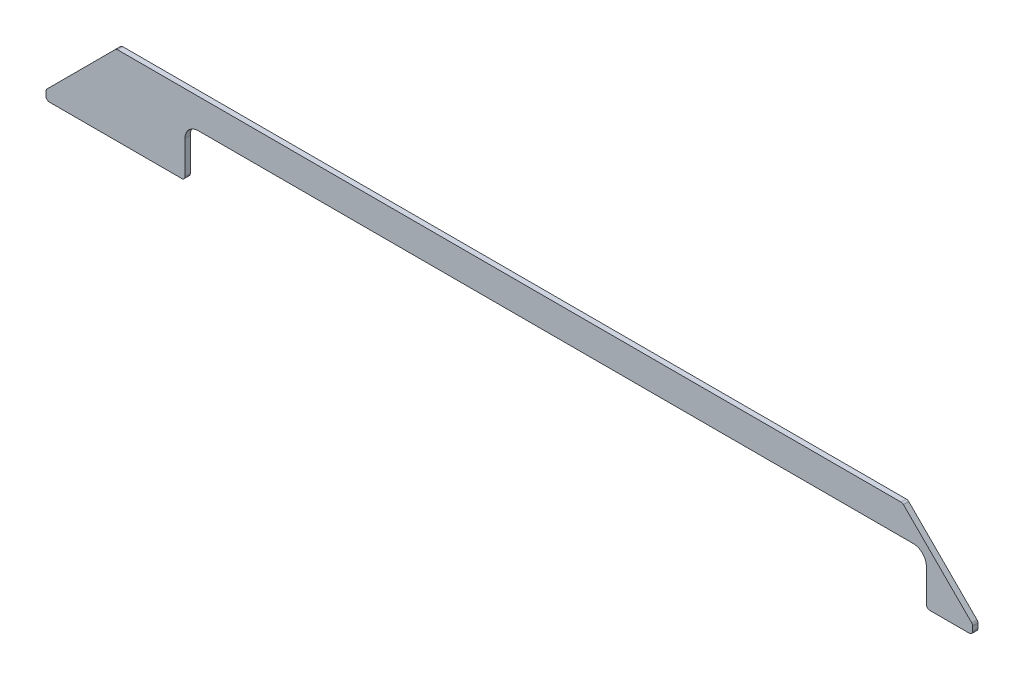
ISO-10303-21;
HEADER;
FILE_DESCRIPTION(('STEP AP214'),'2;1');
FILE_NAME('part.step','',(''),(''),'','','');
FILE_SCHEMA(('AUTOMOTIVE_DESIGN { 1 0 10303 214 1 1 1 1 }'));
ENDSEC;
DATA;
#1=APPLICATION_CONTEXT('core data for automotive mechanical design processes');
#2=APPLICATION_PROTOCOL_DEFINITION('international standard','automotive_design',2000,#1);
#3=PRODUCT_CONTEXT('',#1,'mechanical');
#4=PRODUCT('Part','Part','',(#3));
#5=PRODUCT_RELATED_PRODUCT_CATEGORY('part','',(#4));
#6=PRODUCT_DEFINITION_FORMATION('','',#4);
#7=PRODUCT_DEFINITION_CONTEXT('part definition',#1,'design');
#8=PRODUCT_DEFINITION('design','',#6,#7);
#9=PRODUCT_DEFINITION_SHAPE('','',#8);
#10=(LENGTH_UNIT() NAMED_UNIT(*) SI_UNIT(.MILLI.,.METRE.));
#11=(NAMED_UNIT(*) PLANE_ANGLE_UNIT() SI_UNIT($,.RADIAN.));
#12=(NAMED_UNIT(*) SI_UNIT($,.STERADIAN.) SOLID_ANGLE_UNIT());
#13=UNCERTAINTY_MEASURE_WITH_UNIT(LENGTH_MEASURE(1.E-05),#10,'distance_accuracy_value','');
#14=(GEOMETRIC_REPRESENTATION_CONTEXT(3) GLOBAL_UNCERTAINTY_ASSIGNED_CONTEXT((#13)) GLOBAL_UNIT_ASSIGNED_CONTEXT((#10,
#11,#12)) REPRESENTATION_CONTEXT('',''));
#15=CARTESIAN_POINT('',(0.,0.,0.));
#16=DIRECTION('',(0.,0.,1.));
#17=DIRECTION('',(1.,0.,0.));
#18=AXIS2_PLACEMENT_3D('',#15,#16,#17);
#19=CARTESIAN_POINT('',(42.,0.,1.6));
#20=DIRECTION('',(-1.,0.,0.));
#21=DIRECTION('',(0.,0.,1.));
#22=AXIS2_PLACEMENT_3D('',#19,#20,#21);
#23=PLANE('',#22);
#24=DIRECTION('',(0.,1.,0.));
#25=VECTOR('',#24,1.);
#26=CARTESIAN_POINT('',(42.,0.,1.6));
#27=LINE('',#26,#25);
#28=CARTESIAN_POINT('',(42.,1.,1.6));
#29=VERTEX_POINT('',#28);
#30=CARTESIAN_POINT('',(42.,11.,1.6));
#31=VERTEX_POINT('',#30);
#32=EDGE_CURVE('E175',#29,#31,#27,.T.);
#33=ORIENTED_EDGE('',*,*,#32,.F.);
#34=DIRECTION('',(0.,0.,-1.));
#35=VECTOR('',#34,1.);
#36=CARTESIAN_POINT('',(42.,1.,1.6));
#37=LINE('',#36,#35);
#38=CARTESIAN_POINT('',(42.,1.,0.));
#39=VERTEX_POINT('',#38);
#40=EDGE_CURVE('E258',#29,#39,#37,.T.);
#41=ORIENTED_EDGE('',*,*,#40,.T.);
#42=DIRECTION('',(0.,1.,0.));
#43=VECTOR('',#42,1.);
#44=CARTESIAN_POINT('',(42.,0.,0.));
#45=LINE('',#44,#43);
#46=CARTESIAN_POINT('',(42.,11.,0.));
#47=VERTEX_POINT('',#46);
#48=EDGE_CURVE('E199',#39,#47,#45,.T.);
#49=ORIENTED_EDGE('',*,*,#48,.T.);
#50=DIRECTION('',(0.,0.,-1.));
#51=VECTOR('',#50,1.);
#52=CARTESIAN_POINT('',(42.,11.,1.6));
#53=LINE('',#52,#51);
#54=EDGE_CURVE('E192',#31,#47,#53,.T.);
#55=ORIENTED_EDGE('',*,*,#54,.F.);
#56=EDGE_LOOP('',(#33,#41,#49,#55));
#57=FACE_BOUND('',#56,.T.);
#58=ADVANCED_FACE('F39',(#57),#23,.F.);
#59=CARTESIAN_POINT('',(46.,11.,1.6));
#60=DIRECTION('',(0.,0.,-1.));
#61=DIRECTION('',(-1.,0.,0.));
#62=AXIS2_PLACEMENT_3D('',#59,#60,#61);
#63=CYLINDRICAL_SURFACE('',#62,4.);
#64=CARTESIAN_POINT('',(46.,11.,0.));
#65=DIRECTION('',(0.,0.,1.));
#66=DIRECTION('',(1.,0.,0.));
#67=AXIS2_PLACEMENT_3D('',#64,#65,#66);
#68=CIRCLE('',#67,4.);
#69=CARTESIAN_POINT('',(46.,15.,0.));
#70=VERTEX_POINT('',#69);
#71=EDGE_CURVE('E316',#47,#70,#68,.F.);
#72=ORIENTED_EDGE('',*,*,#71,.T.);
#73=DIRECTION('',(0.,0.,-1.));
#74=VECTOR('',#73,1.);
#75=CARTESIAN_POINT('',(46.,15.,1.6));
#76=LINE('',#75,#74);
#77=CARTESIAN_POINT('',(46.,15.,1.6));
#78=VERTEX_POINT('',#77);
#79=EDGE_CURVE('E194',#78,#70,#76,.T.);
#80=ORIENTED_EDGE('',*,*,#79,.F.);
#81=CARTESIAN_POINT('',(46.,11.,1.6));
#82=DIRECTION('',(0.,0.,1.));
#83=DIRECTION('',(1.,0.,0.));
#84=AXIS2_PLACEMENT_3D('',#81,#82,#83);
#85=CIRCLE('',#84,4.);
#86=EDGE_CURVE('E179',#31,#78,#85,.F.);
#87=ORIENTED_EDGE('',*,*,#86,.F.);
#88=ORIENTED_EDGE('',*,*,#54,.T.);
#89=EDGE_LOOP('',(#72,#80,#87,#88));
#90=FACE_BOUND('',#89,.T.);
#91=ADVANCED_FACE('F191',(#90),#63,.F.);
#92=CARTESIAN_POINT('',(0.,15.,1.6));
#93=DIRECTION('',(0.,1.,0.));
#94=DIRECTION('',(0.,0.,1.));
#95=AXIS2_PLACEMENT_3D('',#92,#93,#94);
#96=PLANE('',#95);
#97=DIRECTION('',(1.,0.,0.));
#98=VECTOR('',#97,1.);
#99=CARTESIAN_POINT('',(0.,15.,0.));
#100=LINE('',#99,#98);
#101=CARTESIAN_POINT('',(262.,15.,0.));
#102=VERTEX_POINT('',#101);
#103=EDGE_CURVE('E310',#70,#102,#100,.T.);
#104=ORIENTED_EDGE('',*,*,#103,.T.);
#105=DIRECTION('',(0.,0.,-1.));
#106=VECTOR('',#105,1.);
#107=CARTESIAN_POINT('',(262.,15.,1.6));
#108=LINE('',#107,#106);
#109=CARTESIAN_POINT('',(262.,15.,1.6));
#110=VERTEX_POINT('',#109);
#111=EDGE_CURVE('E205',#110,#102,#108,.T.);
#112=ORIENTED_EDGE('',*,*,#111,.F.);
#113=DIRECTION('',(1.,0.,0.));
#114=VECTOR('',#113,1.);
#115=CARTESIAN_POINT('',(0.,15.,1.6));
#116=LINE('',#115,#114);
#117=EDGE_CURVE('E196',#78,#110,#116,.T.);
#118=ORIENTED_EDGE('',*,*,#117,.F.);
#119=ORIENTED_EDGE('',*,*,#79,.T.);
#120=EDGE_LOOP('',(#104,#112,#118,#119));
#121=FACE_BOUND('',#120,.T.);
#122=ADVANCED_FACE('F351',(#121),#96,.F.);
#123=CARTESIAN_POINT('',(262.,11.,1.6));
#124=DIRECTION('',(0.,0.,-1.));
#125=DIRECTION('',(-1.,0.,0.));
#126=AXIS2_PLACEMENT_3D('',#123,#124,#125);
#127=CYLINDRICAL_SURFACE('',#126,4.00000000000003);
#128=CARTESIAN_POINT('',(262.,11.,0.));
#129=DIRECTION('',(0.,0.,1.));
#130=DIRECTION('',(1.,0.,0.));
#131=AXIS2_PLACEMENT_3D('',#128,#129,#130);
#132=CIRCLE('',#131,4.00000000000003);
#133=CARTESIAN_POINT('',(266.,11.,0.));
#134=VERTEX_POINT('',#133);
#135=EDGE_CURVE('E305',#102,#134,#132,.F.);
#136=ORIENTED_EDGE('',*,*,#135,.T.);
#137=DIRECTION('',(0.,0.,-1.));
#138=VECTOR('',#137,1.);
#139=CARTESIAN_POINT('',(266.,11.,1.6));
#140=LINE('',#139,#138);
#141=CARTESIAN_POINT('',(266.,11.,1.6));
#142=VERTEX_POINT('',#141);
#143=EDGE_CURVE('E294',#142,#134,#140,.T.);
#144=ORIENTED_EDGE('',*,*,#143,.F.);
#145=CARTESIAN_POINT('',(262.,11.,1.6));
#146=DIRECTION('',(0.,0.,1.));
#147=DIRECTION('',(1.,0.,0.));
#148=AXIS2_PLACEMENT_3D('',#145,#146,#147);
#149=CIRCLE('',#148,4.00000000000003);
#150=EDGE_CURVE('E307',#110,#142,#149,.F.);
#151=ORIENTED_EDGE('',*,*,#150,.F.);
#152=ORIENTED_EDGE('',*,*,#111,.T.);
#153=EDGE_LOOP('',(#136,#144,#151,#152));
#154=FACE_BOUND('',#153,.T.);
#155=ADVANCED_FACE('F303',(#154),#127,.F.);
#156=CARTESIAN_POINT('',(266.,-1.34236056613769E-12,1.6));
#157=DIRECTION('',(-1.,0.,0.));
#158=DIRECTION('',(0.,-1.,0.));
#159=AXIS2_PLACEMENT_3D('',#156,#157,#158);
#160=PLANE('',#159);
#161=DIRECTION('',(0.,1.,0.));
#162=VECTOR('',#161,1.);
#163=CARTESIAN_POINT('',(266.,-1.34236056613769E-12,0.));
#164=LINE('',#163,#162);
#165=CARTESIAN_POINT('',(266.,1.00000000000001,0.));
#166=VERTEX_POINT('',#165);
#167=EDGE_CURVE('E312',#166,#134,#164,.T.);
#168=ORIENTED_EDGE('',*,*,#167,.F.);
#169=DIRECTION('',(0.,0.,-1.));
#170=VECTOR('',#169,1.);
#171=CARTESIAN_POINT('',(266.,1.00000000000001,1.6));
#172=LINE('',#171,#170);
#173=CARTESIAN_POINT('',(266.,1.00000000000001,1.6));
#174=VERTEX_POINT('',#173);
#175=EDGE_CURVE('E256',#166,#174,#172,.F.);
#176=ORIENTED_EDGE('',*,*,#175,.T.);
#177=DIRECTION('',(0.,1.,0.));
#178=VECTOR('',#177,1.);
#179=CARTESIAN_POINT('',(266.,-1.34236056613769E-12,1.6));
#180=LINE('',#179,#178);
#181=EDGE_CURVE('E353',#174,#142,#180,.T.);
#182=ORIENTED_EDGE('',*,*,#181,.T.);
#183=ORIENTED_EDGE('',*,*,#143,.T.);
#184=EDGE_LOOP('',(#168,#176,#182,#183));
#185=FACE_BOUND('',#184,.T.);
#186=ADVANCED_FACE('F424',(#185),#160,.T.);
#187=CARTESIAN_POINT('',(0.,0.,1.6));
#188=DIRECTION('',(0.,1.,0.));
#189=DIRECTION('',(0.,0.,1.));
#190=AXIS2_PLACEMENT_3D('',#187,#188,#189);
#191=PLANE('',#190);
#192=DIRECTION('',(1.,0.,0.));
#193=VECTOR('',#192,1.);
#194=CARTESIAN_POINT('',(0.,0.,0.));
#195=LINE('',#194,#193);
#196=CARTESIAN_POINT('',(267.,0.,0.));
#197=VERTEX_POINT('',#196);
#198=CARTESIAN_POINT('',(279.,0.,0.));
#199=VERTEX_POINT('',#198);
#200=EDGE_CURVE('E314',#197,#199,#195,.T.);
#201=ORIENTED_EDGE('',*,*,#200,.T.);
#202=DIRECTION('',(0.,0.,-1.));
#203=VECTOR('',#202,1.);
#204=CARTESIAN_POINT('',(279.,0.,1.6));
#205=LINE('',#204,#203);
#206=CARTESIAN_POINT('',(279.,0.,1.6));
#207=VERTEX_POINT('',#206);
#208=EDGE_CURVE('E254',#199,#207,#205,.F.);
#209=ORIENTED_EDGE('',*,*,#208,.T.);
#210=DIRECTION('',(1.,0.,0.));
#211=VECTOR('',#210,1.);
#212=CARTESIAN_POINT('',(0.,0.,1.6));
#213=LINE('',#212,#211);
#214=CARTESIAN_POINT('',(267.,0.,1.6));
#215=VERTEX_POINT('',#214);
#216=EDGE_CURVE('E357',#215,#207,#213,.T.);
#217=ORIENTED_EDGE('',*,*,#216,.F.);
#218=DIRECTION('',(0.,0.,-1.));
#219=VECTOR('',#218,1.);
#220=CARTESIAN_POINT('',(267.,0.,0.));
#221=LINE('',#220,#219);
#222=EDGE_CURVE('E251',#215,#197,#221,.T.);
#223=ORIENTED_EDGE('',*,*,#222,.T.);
#224=EDGE_LOOP('',(#201,#209,#217,#223));
#225=FACE_BOUND('',#224,.T.);
#226=ADVANCED_FACE('F412',(#225),#191,.F.);
#227=CARTESIAN_POINT('',(280.,0.,1.6));
#228=DIRECTION('',(-1.,0.,0.));
#229=DIRECTION('',(0.,0.,1.));
#230=AXIS2_PLACEMENT_3D('',#227,#228,#229);
#231=PLANE('',#230);
#232=DIRECTION('',(0.,1.,0.));
#233=VECTOR('',#232,1.);
#234=CARTESIAN_POINT('',(280.,0.,1.6));
#235=LINE('',#234,#233);
#236=CARTESIAN_POINT('',(280.,1.,1.6));
#237=VERTEX_POINT('',#236);
#238=CARTESIAN_POINT('',(280.,2.37258300203055,1.6));
#239=VERTEX_POINT('',#238);
#240=EDGE_CURVE('E345',#237,#239,#235,.T.);
#241=ORIENTED_EDGE('',*,*,#240,.F.);
#242=DIRECTION('',(0.,0.,-1.));
#243=VECTOR('',#242,1.);
#244=CARTESIAN_POINT('',(280.,1.,1.6));
#245=LINE('',#244,#243);
#246=CARTESIAN_POINT('',(280.,1.,0.));
#247=VERTEX_POINT('',#246);
#248=EDGE_CURVE('E248',#237,#247,#245,.T.);
#249=ORIENTED_EDGE('',*,*,#248,.T.);
#250=DIRECTION('',(0.,1.,0.));
#251=VECTOR('',#250,1.);
#252=CARTESIAN_POINT('',(280.,0.,0.));
#253=LINE('',#252,#251);
#254=CARTESIAN_POINT('',(280.,2.37258300203055,0.));
#255=VERTEX_POINT('',#254);
#256=EDGE_CURVE('E322',#247,#255,#253,.T.);
#257=ORIENTED_EDGE('',*,*,#256,.T.);
#258=DIRECTION('',(0.,0.,-1.));
#259=VECTOR('',#258,1.);
#260=CARTESIAN_POINT('',(280.,2.37258300203055,1.6));
#261=LINE('',#260,#259);
#262=EDGE_CURVE('E246',#255,#239,#261,.F.);
#263=ORIENTED_EDGE('',*,*,#262,.T.);
#264=EDGE_LOOP('',(#241,#249,#257,#263));
#265=FACE_BOUND('',#264,.T.);
#266=ADVANCED_FACE('F374',(#265),#231,.F.);
#267=CARTESIAN_POINT('',(141.393398282201,141.393398282202,1.6));
#268=DIRECTION('',(-0.707106781186545,-0.70710678118655,0.));
#269=DIRECTION('',(0.70710678118655,-0.707106781186545,0.));
#270=AXIS2_PLACEMENT_3D('',#267,#268,#269);
#271=PLANE('',#270);
#272=DIRECTION('',(-0.70710678118655,0.707106781186545,0.));
#273=VECTOR('',#272,1.);
#274=CARTESIAN_POINT('',(141.393398282201,141.393398282202,0.));
#275=LINE('',#274,#273);
#276=CARTESIAN_POINT('',(279.707106781187,3.0796897832171,0.));
#277=VERTEX_POINT('',#276);
#278=CARTESIAN_POINT('',(259.079689783217,23.7071067811865,0.));
#279=VERTEX_POINT('',#278);
#280=EDGE_CURVE('E290',#277,#279,#275,.T.);
#281=ORIENTED_EDGE('',*,*,#280,.T.);
#282=DIRECTION('',(0.,0.,-1.));
#283=VECTOR('',#282,1.);
#284=CARTESIAN_POINT('',(259.079689783217,23.7071067811866,1.6));
#285=LINE('',#284,#283);
#286=CARTESIAN_POINT('',(259.079689783217,23.7071067811865,1.6));
#287=VERTEX_POINT('',#286);
#288=EDGE_CURVE('E230',#279,#287,#285,.F.);
#289=ORIENTED_EDGE('',*,*,#288,.T.);
#290=DIRECTION('',(-0.70710678118655,0.707106781186545,0.));
#291=VECTOR('',#290,1.);
#292=CARTESIAN_POINT('',(141.393398282201,141.393398282202,1.6));
#293=LINE('',#292,#291);
#294=CARTESIAN_POINT('',(279.707106781187,3.0796897832171,1.6));
#295=VERTEX_POINT('',#294);
#296=EDGE_CURVE('E338',#295,#287,#293,.T.);
#297=ORIENTED_EDGE('',*,*,#296,.F.);
#298=DIRECTION('',(0.,0.,-1.));
#299=VECTOR('',#298,1.);
#300=CARTESIAN_POINT('',(279.707106781187,3.07968978321713,1.6));
#301=LINE('',#300,#299);
#302=EDGE_CURVE('E227',#295,#277,#301,.T.);
#303=ORIENTED_EDGE('',*,*,#302,.T.);
#304=EDGE_LOOP('',(#281,#289,#297,#303));
#305=FACE_BOUND('',#304,.T.);
#306=ADVANCED_FACE('F328',(#305),#271,.F.);
#307=CARTESIAN_POINT('',(0.,24.,1.6));
#308=DIRECTION('',(0.,1.,0.));
#309=DIRECTION('',(0.,0.,1.));
#310=AXIS2_PLACEMENT_3D('',#307,#308,#309);
#311=PLANE('',#310);
#312=DIRECTION('',(1.,0.,0.));
#313=VECTOR('',#312,1.);
#314=CARTESIAN_POINT('',(0.,24.,1.6));
#315=LINE('',#314,#313);
#316=CARTESIAN_POINT('',(21.6274169979696,24.,1.6));
#317=VERTEX_POINT('',#316);
#318=CARTESIAN_POINT('',(258.37258300203,24.,1.6));
#319=VERTEX_POINT('',#318);
#320=EDGE_CURVE('E337',#317,#319,#315,.T.);
#321=ORIENTED_EDGE('',*,*,#320,.T.);
#322=DIRECTION('',(0.,0.,-1.));
#323=VECTOR('',#322,1.);
#324=CARTESIAN_POINT('',(258.37258300203,24.,0.));
#325=LINE('',#324,#323);
#326=CARTESIAN_POINT('',(258.37258300203,24.,0.));
#327=VERTEX_POINT('',#326);
#328=EDGE_CURVE('E203',#319,#327,#325,.T.);
#329=ORIENTED_EDGE('',*,*,#328,.T.);
#330=DIRECTION('',(1.,0.,0.));
#331=VECTOR('',#330,1.);
#332=CARTESIAN_POINT('',(0.,24.,0.));
#333=LINE('',#332,#331);
#334=CARTESIAN_POINT('',(21.6274169979696,24.,0.));
#335=VERTEX_POINT('',#334);
#336=EDGE_CURVE('E287',#335,#327,#333,.T.);
#337=ORIENTED_EDGE('',*,*,#336,.F.);
#338=DIRECTION('',(0.,0.,-1.));
#339=VECTOR('',#338,1.);
#340=CARTESIAN_POINT('',(21.6274169979696,24.,1.6));
#341=LINE('',#340,#339);
#342=EDGE_CURVE('E201',#335,#317,#341,.F.);
#343=ORIENTED_EDGE('',*,*,#342,.T.);
#344=EDGE_LOOP('',(#321,#329,#337,#343));
#345=FACE_BOUND('',#344,.T.);
#346=ADVANCED_FACE('F340',(#345),#311,.T.);
#347=CARTESIAN_POINT('',(-1.39339828220181,1.39339828220181,1.6));
#348=DIRECTION('',(-0.707106781186546,0.707106781186549,0.));
#349=DIRECTION('',(-0.707106781186549,-0.707106781186546,0.));
#350=AXIS2_PLACEMENT_3D('',#347,#348,#349);
#351=PLANE('',#350);
#352=DIRECTION('',(0.707106781186549,0.707106781186546,0.));
#353=VECTOR('',#352,1.);
#354=CARTESIAN_POINT('',(-1.39339828220181,1.39339828220181,0.));
#355=LINE('',#354,#353);
#356=CARTESIAN_POINT('',(0.292893218813454,3.07968978321706,0.));
#357=VERTEX_POINT('',#356);
#358=CARTESIAN_POINT('',(20.920310216783,23.7071067811866,0.));
#359=VERTEX_POINT('',#358);
#360=EDGE_CURVE('E275',#357,#359,#355,.T.);
#361=ORIENTED_EDGE('',*,*,#360,.F.);
#362=DIRECTION('',(0.,0.,-1.));
#363=VECTOR('',#362,1.);
#364=CARTESIAN_POINT('',(0.292893218813454,3.07968978321706,1.6));
#365=LINE('',#364,#363);
#366=CARTESIAN_POINT('',(0.292893218813454,3.07968978321706,1.6));
#367=VERTEX_POINT('',#366);
#368=EDGE_CURVE('E11',#357,#367,#365,.F.);
#369=ORIENTED_EDGE('',*,*,#368,.T.);
#370=DIRECTION('',(0.707106781186549,0.707106781186546,0.));
#371=VECTOR('',#370,1.);
#372=CARTESIAN_POINT('',(-1.39339828220181,1.39339828220181,1.6));
#373=LINE('',#372,#371);
#374=CARTESIAN_POINT('',(20.920310216783,23.7071067811866,1.6));
#375=VERTEX_POINT('',#374);
#376=EDGE_CURVE('E278',#367,#375,#373,.T.);
#377=ORIENTED_EDGE('',*,*,#376,.T.);
#378=DIRECTION('',(0.,0.,-1.));
#379=VECTOR('',#378,1.);
#380=CARTESIAN_POINT('',(20.920310216783,23.7071067811865,1.6));
#381=LINE('',#380,#379);
#382=EDGE_CURVE('E47',#375,#359,#381,.T.);
#383=ORIENTED_EDGE('',*,*,#382,.T.);
#384=EDGE_LOOP('',(#361,#369,#377,#383));
#385=FACE_BOUND('',#384,.T.);
#386=ADVANCED_FACE('F274',(#385),#351,.T.);
#387=CARTESIAN_POINT('',(0.,0.,1.6));
#388=DIRECTION('',(-1.,0.,0.));
#389=DIRECTION('',(0.,0.,1.));
#390=AXIS2_PLACEMENT_3D('',#387,#388,#389);
#391=PLANE('',#390);
#392=DIRECTION('',(0.,1.,0.));
#393=VECTOR('',#392,1.);
#394=CARTESIAN_POINT('',(0.,0.,1.6));
#395=LINE('',#394,#393);
#396=CARTESIAN_POINT('',(0.,1.,1.6));
#397=VERTEX_POINT('',#396);
#398=CARTESIAN_POINT('',(0.,2.37258300203052,1.6));
#399=VERTEX_POINT('',#398);
#400=EDGE_CURVE('E343',#397,#399,#395,.T.);
#401=ORIENTED_EDGE('',*,*,#400,.T.);
#402=DIRECTION('',(0.,0.,-1.));
#403=VECTOR('',#402,1.);
#404=CARTESIAN_POINT('',(0.,2.37258300203052,1.6));
#405=LINE('',#404,#403);
#406=CARTESIAN_POINT('',(0.,2.37258300203052,0.));
#407=VERTEX_POINT('',#406);
#408=EDGE_CURVE('E266',#399,#407,#405,.T.);
#409=ORIENTED_EDGE('',*,*,#408,.T.);
#410=DIRECTION('',(0.,1.,0.));
#411=VECTOR('',#410,1.);
#412=CARTESIAN_POINT('',(0.,0.,0.));
#413=LINE('',#412,#411);
#414=CARTESIAN_POINT('',(0.,1.,0.));
#415=VERTEX_POINT('',#414);
#416=EDGE_CURVE('E286',#415,#407,#413,.T.);
#417=ORIENTED_EDGE('',*,*,#416,.F.);
#418=DIRECTION('',(0.,0.,-1.));
#419=VECTOR('',#418,1.);
#420=CARTESIAN_POINT('',(0.,1.,1.6));
#421=LINE('',#420,#419);
#422=EDGE_CURVE('E264',#415,#397,#421,.F.);
#423=ORIENTED_EDGE('',*,*,#422,.T.);
#424=EDGE_LOOP('',(#401,#409,#417,#423));
#425=FACE_BOUND('',#424,.T.);
#426=ADVANCED_FACE('F411',(#425),#391,.T.);
#427=CARTESIAN_POINT('',(1.,0.,0.));
#428=VERTEX_POINT('',#427);
#429=CARTESIAN_POINT('',(41.,0.,0.));
#430=VERTEX_POINT('',#429);
#431=EDGE_CURVE('E187',#428,#430,#195,.T.);
#432=ORIENTED_EDGE('',*,*,#431,.T.);
#433=DIRECTION('',(0.,0.,-1.));
#434=VECTOR('',#433,1.);
#435=CARTESIAN_POINT('',(41.,0.,1.6));
#436=LINE('',#435,#434);
#437=CARTESIAN_POINT('',(41.,0.,1.6));
#438=VERTEX_POINT('',#437);
#439=EDGE_CURVE('E54',#430,#438,#436,.F.);
#440=ORIENTED_EDGE('',*,*,#439,.T.);
#441=CARTESIAN_POINT('',(1.,0.,1.6));
#442=VERTEX_POINT('',#441);
#443=EDGE_CURVE('E296',#442,#438,#213,.T.);
#444=ORIENTED_EDGE('',*,*,#443,.F.);
#445=DIRECTION('',(0.,0.,-1.));
#446=VECTOR('',#445,1.);
#447=CARTESIAN_POINT('',(1.,0.,0.));
#448=LINE('',#447,#446);
#449=EDGE_CURVE('E260',#442,#428,#448,.T.);
#450=ORIENTED_EDGE('',*,*,#449,.T.);
#451=EDGE_LOOP('',(#432,#440,#444,#450));
#452=FACE_BOUND('',#451,.T.);
#453=ADVANCED_FACE('F406',(#452),#191,.F.);
#454=CARTESIAN_POINT('',(0.,0.,1.6));
#455=DIRECTION('',(0.,0.,1.));
#456=DIRECTION('',(1.,0.,0.));
#457=AXIS2_PLACEMENT_3D('',#454,#455,#456);
#458=PLANE('',#457);
#459=ORIENTED_EDGE('',*,*,#296,.T.);
#460=CARTESIAN_POINT('',(258.37258300203,23.,1.6));
#461=DIRECTION('',(0.,0.,1.));
#462=DIRECTION('',(1.,0.,0.));
#463=AXIS2_PLACEMENT_3D('',#460,#461,#462);
#464=CIRCLE('',#463,1.);
#465=EDGE_CURVE('E244',#287,#319,#464,.T.);
#466=ORIENTED_EDGE('',*,*,#465,.T.);
#467=ORIENTED_EDGE('',*,*,#320,.F.);
#468=CARTESIAN_POINT('',(21.6274169979696,23.,1.6));
#469=DIRECTION('',(0.,0.,1.));
#470=DIRECTION('',(1.,0.,0.));
#471=AXIS2_PLACEMENT_3D('',#468,#469,#470);
#472=CIRCLE('',#471,1.);
#473=EDGE_CURVE('E232',#317,#375,#472,.T.);
#474=ORIENTED_EDGE('',*,*,#473,.T.);
#475=ORIENTED_EDGE('',*,*,#376,.F.);
#476=CARTESIAN_POINT('',(1.,2.37258300203052,1.6));
#477=DIRECTION('',(0.,0.,1.));
#478=DIRECTION('',(1.,0.,0.));
#479=AXIS2_PLACEMENT_3D('',#476,#477,#478);
#480=CIRCLE('',#479,1.);
#481=EDGE_CURVE('E235',#367,#399,#480,.T.);
#482=ORIENTED_EDGE('',*,*,#481,.T.);
#483=ORIENTED_EDGE('',*,*,#400,.F.);
#484=CARTESIAN_POINT('',(1.,1.,1.6));
#485=DIRECTION('',(0.,0.,1.));
#486=DIRECTION('',(1.,0.,0.));
#487=AXIS2_PLACEMENT_3D('',#484,#485,#486);
#488=CIRCLE('',#487,1.);
#489=EDGE_CURVE('E61',#397,#442,#488,.T.);
#490=ORIENTED_EDGE('',*,*,#489,.T.);
#491=ORIENTED_EDGE('',*,*,#443,.T.);
#492=CARTESIAN_POINT('',(41.,1.,1.6));
#493=DIRECTION('',(0.,0.,1.));
#494=DIRECTION('',(1.,0.,0.));
#495=AXIS2_PLACEMENT_3D('',#492,#493,#494);
#496=CIRCLE('',#495,1.);
#497=EDGE_CURVE('E182',#438,#29,#496,.T.);
#498=ORIENTED_EDGE('',*,*,#497,.T.);
#499=ORIENTED_EDGE('',*,*,#32,.T.);
#500=ORIENTED_EDGE('',*,*,#86,.T.);
#501=ORIENTED_EDGE('',*,*,#117,.T.);
#502=ORIENTED_EDGE('',*,*,#150,.T.);
#503=ORIENTED_EDGE('',*,*,#181,.F.);
#504=CARTESIAN_POINT('',(267.,1.,1.6));
#505=DIRECTION('',(0.,0.,1.));
#506=DIRECTION('',(1.,0.,0.));
#507=AXIS2_PLACEMENT_3D('',#504,#505,#506);
#508=CIRCLE('',#507,1.);
#509=EDGE_CURVE('E238',#174,#215,#508,.T.);
#510=ORIENTED_EDGE('',*,*,#509,.T.);
#511=ORIENTED_EDGE('',*,*,#216,.T.);
#512=CARTESIAN_POINT('',(279.,1.,1.6));
#513=DIRECTION('',(0.,0.,1.));
#514=DIRECTION('',(1.,0.,0.));
#515=AXIS2_PLACEMENT_3D('',#512,#513,#514);
#516=CIRCLE('',#515,1.);
#517=EDGE_CURVE('E242',#207,#237,#516,.T.);
#518=ORIENTED_EDGE('',*,*,#517,.T.);
#519=ORIENTED_EDGE('',*,*,#240,.T.);
#520=CARTESIAN_POINT('',(279.,2.37258300203055,1.6));
#521=DIRECTION('',(0.,0.,1.));
#522=DIRECTION('',(1.,0.,0.));
#523=AXIS2_PLACEMENT_3D('',#520,#521,#522);
#524=CIRCLE('',#523,1.);
#525=EDGE_CURVE('E240',#239,#295,#524,.T.);
#526=ORIENTED_EDGE('',*,*,#525,.T.);
#527=EDGE_LOOP('',(#459,#466,#467,#474,#475,#482,#483,#490,#491,#498,#499,#500,#501,#502,#503,
#510,#511,#518,#519,#526));
#528=FACE_BOUND('',#527,.T.);
#529=ADVANCED_FACE('F178',(#528),#458,.T.);
#530=CARTESIAN_POINT('',(0.,0.,0.));
#531=DIRECTION('',(0.,0.,1.));
#532=DIRECTION('',(1.,0.,0.));
#533=AXIS2_PLACEMENT_3D('',#530,#531,#532);
#534=PLANE('',#533);
#535=ORIENTED_EDGE('',*,*,#336,.T.);
#536=CARTESIAN_POINT('',(258.37258300203,23.,0.));
#537=DIRECTION('',(0.,0.,1.));
#538=DIRECTION('',(1.,0.,0.));
#539=AXIS2_PLACEMENT_3D('',#536,#537,#538);
#540=CIRCLE('',#539,1.);
#541=EDGE_CURVE('E225',#327,#279,#540,.F.);
#542=ORIENTED_EDGE('',*,*,#541,.T.);
#543=ORIENTED_EDGE('',*,*,#280,.F.);
#544=CARTESIAN_POINT('',(279.,2.37258300203055,0.));
#545=DIRECTION('',(0.,0.,1.));
#546=DIRECTION('',(1.,0.,0.));
#547=AXIS2_PLACEMENT_3D('',#544,#545,#546);
#548=CIRCLE('',#547,1.);
#549=EDGE_CURVE('E221',#277,#255,#548,.F.);
#550=ORIENTED_EDGE('',*,*,#549,.T.);
#551=ORIENTED_EDGE('',*,*,#256,.F.);
#552=CARTESIAN_POINT('',(279.,1.,0.));
#553=DIRECTION('',(0.,0.,1.));
#554=DIRECTION('',(1.,0.,0.));
#555=AXIS2_PLACEMENT_3D('',#552,#553,#554);
#556=CIRCLE('',#555,1.);
#557=EDGE_CURVE('E223',#247,#199,#556,.F.);
#558=ORIENTED_EDGE('',*,*,#557,.T.);
#559=ORIENTED_EDGE('',*,*,#200,.F.);
#560=CARTESIAN_POINT('',(267.,1.,0.));
#561=DIRECTION('',(0.,0.,1.));
#562=DIRECTION('',(1.,0.,0.));
#563=AXIS2_PLACEMENT_3D('',#560,#561,#562);
#564=CIRCLE('',#563,1.);
#565=EDGE_CURVE('E219',#197,#166,#564,.F.);
#566=ORIENTED_EDGE('',*,*,#565,.T.);
#567=ORIENTED_EDGE('',*,*,#167,.T.);
#568=ORIENTED_EDGE('',*,*,#135,.F.);
#569=ORIENTED_EDGE('',*,*,#103,.F.);
#570=ORIENTED_EDGE('',*,*,#71,.F.);
#571=ORIENTED_EDGE('',*,*,#48,.F.);
#572=CARTESIAN_POINT('',(41.,1.,0.));
#573=DIRECTION('',(0.,0.,1.));
#574=DIRECTION('',(1.,0.,0.));
#575=AXIS2_PLACEMENT_3D('',#572,#573,#574);
#576=CIRCLE('',#575,1.);
#577=EDGE_CURVE('E217',#39,#430,#576,.F.);
#578=ORIENTED_EDGE('',*,*,#577,.T.);
#579=ORIENTED_EDGE('',*,*,#431,.F.);
#580=CARTESIAN_POINT('',(1.,1.,0.));
#581=DIRECTION('',(0.,0.,1.));
#582=DIRECTION('',(1.,0.,0.));
#583=AXIS2_PLACEMENT_3D('',#580,#581,#582);
#584=CIRCLE('',#583,1.);
#585=EDGE_CURVE('E213',#428,#415,#584,.F.);
#586=ORIENTED_EDGE('',*,*,#585,.T.);
#587=ORIENTED_EDGE('',*,*,#416,.T.);
#588=CARTESIAN_POINT('',(1.,2.37258300203052,0.));
#589=DIRECTION('',(0.,0.,1.));
#590=DIRECTION('',(1.,0.,0.));
#591=AXIS2_PLACEMENT_3D('',#588,#589,#590);
#592=CIRCLE('',#591,1.);
#593=EDGE_CURVE('E215',#407,#357,#592,.F.);
#594=ORIENTED_EDGE('',*,*,#593,.T.);
#595=ORIENTED_EDGE('',*,*,#360,.T.);
#596=CARTESIAN_POINT('',(21.6274169979696,23.,0.));
#597=DIRECTION('',(0.,0.,1.));
#598=DIRECTION('',(1.,0.,0.));
#599=AXIS2_PLACEMENT_3D('',#596,#597,#598);
#600=CIRCLE('',#599,1.);
#601=EDGE_CURVE('E211',#359,#335,#600,.F.);
#602=ORIENTED_EDGE('',*,*,#601,.T.);
#603=EDGE_LOOP('',(#535,#542,#543,#550,#551,#558,#559,#566,#567,#568,#569,#570,#571,#578,#579,
#586,#587,#594,#595,#602));
#604=FACE_BOUND('',#603,.T.);
#605=ADVANCED_FACE('F283',(#604),#534,.F.);
#606=CARTESIAN_POINT('',(258.37258300203,23.,1.6));
#607=DIRECTION('',(0.,0.,1.));
#608=DIRECTION('',(1.,0.,0.));
#609=AXIS2_PLACEMENT_3D('',#606,#607,#608);
#610=CYLINDRICAL_SURFACE('',#609,1.);
#611=ORIENTED_EDGE('',*,*,#465,.F.);
#612=ORIENTED_EDGE('',*,*,#288,.F.);
#613=ORIENTED_EDGE('',*,*,#541,.F.);
#614=ORIENTED_EDGE('',*,*,#328,.F.);
#615=EDGE_LOOP('',(#611,#612,#613,#614));
#616=FACE_BOUND('',#615,.T.);
#617=ADVANCED_FACE('F333',(#616),#610,.T.);
#618=CARTESIAN_POINT('',(279.,1.,1.6));
#619=DIRECTION('',(0.,0.,-1.));
#620=DIRECTION('',(-1.,0.,0.));
#621=AXIS2_PLACEMENT_3D('',#618,#619,#620);
#622=CYLINDRICAL_SURFACE('',#621,1.);
#623=ORIENTED_EDGE('',*,*,#517,.F.);
#624=ORIENTED_EDGE('',*,*,#208,.F.);
#625=ORIENTED_EDGE('',*,*,#557,.F.);
#626=ORIENTED_EDGE('',*,*,#248,.F.);
#627=EDGE_LOOP('',(#623,#624,#625,#626));
#628=FACE_BOUND('',#627,.T.);
#629=ADVANCED_FACE('F371',(#628),#622,.T.);
#630=CARTESIAN_POINT('',(279.,2.37258300203055,1.6));
#631=DIRECTION('',(0.,0.,-1.));
#632=DIRECTION('',(-1.,0.,0.));
#633=AXIS2_PLACEMENT_3D('',#630,#631,#632);
#634=CYLINDRICAL_SURFACE('',#633,1.);
#635=ORIENTED_EDGE('',*,*,#525,.F.);
#636=ORIENTED_EDGE('',*,*,#262,.F.);
#637=ORIENTED_EDGE('',*,*,#549,.F.);
#638=ORIENTED_EDGE('',*,*,#302,.F.);
#639=EDGE_LOOP('',(#635,#636,#637,#638));
#640=FACE_BOUND('',#639,.T.);
#641=ADVANCED_FACE('F378',(#640),#634,.T.);
#642=CARTESIAN_POINT('',(267.,1.,1.6));
#643=DIRECTION('',(0.,0.,1.));
#644=DIRECTION('',(1.,0.,0.));
#645=AXIS2_PLACEMENT_3D('',#642,#643,#644);
#646=CYLINDRICAL_SURFACE('',#645,1.);
#647=ORIENTED_EDGE('',*,*,#509,.F.);
#648=ORIENTED_EDGE('',*,*,#175,.F.);
#649=ORIENTED_EDGE('',*,*,#565,.F.);
#650=ORIENTED_EDGE('',*,*,#222,.F.);
#651=EDGE_LOOP('',(#647,#648,#649,#650));
#652=FACE_BOUND('',#651,.T.);
#653=ADVANCED_FACE('F380',(#652),#646,.T.);
#654=CARTESIAN_POINT('',(41.,1.,1.6));
#655=DIRECTION('',(0.,0.,-1.));
#656=DIRECTION('',(-1.,0.,0.));
#657=AXIS2_PLACEMENT_3D('',#654,#655,#656);
#658=CYLINDRICAL_SURFACE('',#657,1.);
#659=ORIENTED_EDGE('',*,*,#497,.F.);
#660=ORIENTED_EDGE('',*,*,#439,.F.);
#661=ORIENTED_EDGE('',*,*,#577,.F.);
#662=ORIENTED_EDGE('',*,*,#40,.F.);
#663=EDGE_LOOP('',(#659,#660,#661,#662));
#664=FACE_BOUND('',#663,.T.);
#665=ADVANCED_FACE('F386',(#664),#658,.T.);
#666=CARTESIAN_POINT('',(1.,2.37258300203052,1.6));
#667=DIRECTION('',(0.,0.,-1.));
#668=DIRECTION('',(-1.,0.,0.));
#669=AXIS2_PLACEMENT_3D('',#666,#667,#668);
#670=CYLINDRICAL_SURFACE('',#669,1.);
#671=ORIENTED_EDGE('',*,*,#481,.F.);
#672=ORIENTED_EDGE('',*,*,#368,.F.);
#673=ORIENTED_EDGE('',*,*,#593,.F.);
#674=ORIENTED_EDGE('',*,*,#408,.F.);
#675=EDGE_LOOP('',(#671,#672,#673,#674));
#676=FACE_BOUND('',#675,.T.);
#677=ADVANCED_FACE('F508',(#676),#670,.T.);
#678=CARTESIAN_POINT('',(1.,1.,1.6));
#679=DIRECTION('',(0.,0.,1.));
#680=DIRECTION('',(1.,0.,0.));
#681=AXIS2_PLACEMENT_3D('',#678,#679,#680);
#682=CYLINDRICAL_SURFACE('',#681,1.);
#683=ORIENTED_EDGE('',*,*,#489,.F.);
#684=ORIENTED_EDGE('',*,*,#422,.F.);
#685=ORIENTED_EDGE('',*,*,#585,.F.);
#686=ORIENTED_EDGE('',*,*,#449,.F.);
#687=EDGE_LOOP('',(#683,#684,#685,#686));
#688=FACE_BOUND('',#687,.T.);
#689=ADVANCED_FACE('F518',(#688),#682,.T.);
#690=CARTESIAN_POINT('',(21.6274169979696,23.,1.6));
#691=DIRECTION('',(0.,0.,-1.));
#692=DIRECTION('',(-1.,0.,0.));
#693=AXIS2_PLACEMENT_3D('',#690,#691,#692);
#694=CYLINDRICAL_SURFACE('',#693,1.);
#695=ORIENTED_EDGE('',*,*,#473,.F.);
#696=ORIENTED_EDGE('',*,*,#342,.F.);
#697=ORIENTED_EDGE('',*,*,#601,.F.);
#698=ORIENTED_EDGE('',*,*,#382,.F.);
#699=EDGE_LOOP('',(#695,#696,#697,#698));
#700=FACE_BOUND('',#699,.T.);
#701=ADVANCED_FACE('F41',(#700),#694,.T.);
#702=CLOSED_SHELL('',(#58,#91,#122,#155,#186,#226,#266,#306,#346,#386,#426,#453,#529,#605,#617,
#629,#641,#653,#665,#677,#689,#701));
#703=MANIFOLD_SOLID_BREP('B2',#702);
#704=ADVANCED_BREP_SHAPE_REPRESENTATION('',(#18,#703),#14);
#705=SHAPE_DEFINITION_REPRESENTATION(#9,#704);
ENDSEC;
END-ISO-10303-21;
